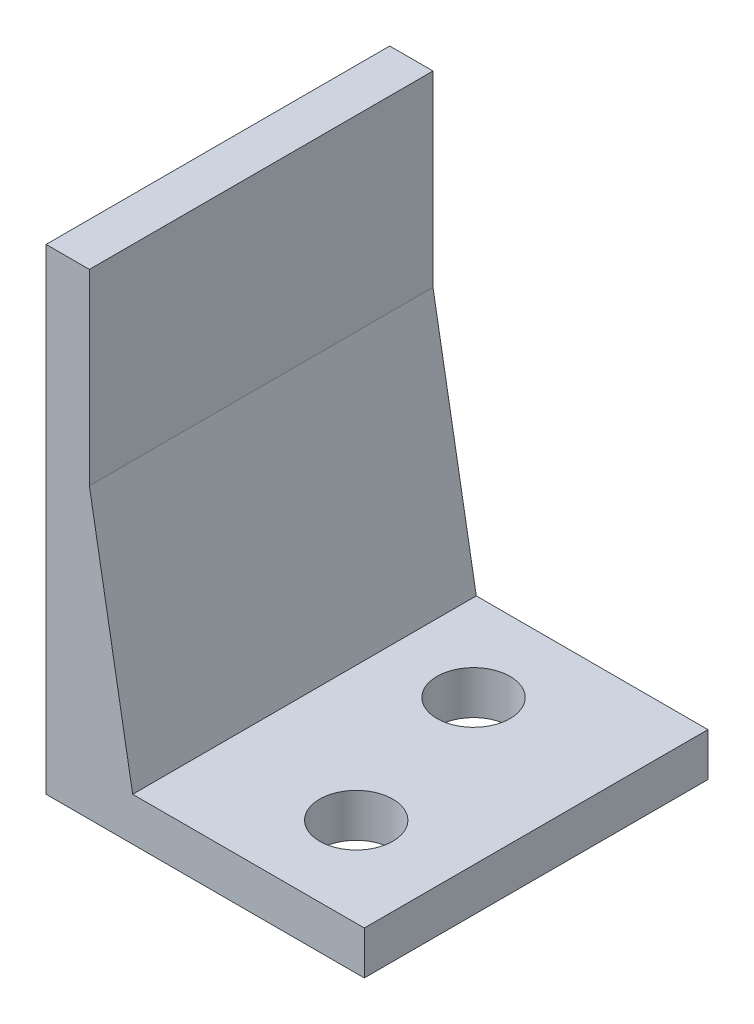
ISO-10303-21;
HEADER;
FILE_DESCRIPTION(('STEP AP214'),'2;1');
FILE_NAME('part.step','',(''),(''),'','','');
FILE_SCHEMA(('AUTOMOTIVE_DESIGN { 1 0 10303 214 1 1 1 1 }'));
ENDSEC;
DATA;
#1=APPLICATION_CONTEXT('core data for automotive mechanical design processes');
#2=APPLICATION_PROTOCOL_DEFINITION('international standard','automotive_design',2000,#1);
#3=PRODUCT_CONTEXT('',#1,'mechanical');
#4=PRODUCT('Part','Part','',(#3));
#5=PRODUCT_RELATED_PRODUCT_CATEGORY('part','',(#4));
#6=PRODUCT_DEFINITION_FORMATION('','',#4);
#7=PRODUCT_DEFINITION_CONTEXT('part definition',#1,'design');
#8=PRODUCT_DEFINITION('design','',#6,#7);
#9=PRODUCT_DEFINITION_SHAPE('','',#8);
#10=(LENGTH_UNIT() NAMED_UNIT(*) SI_UNIT(.MILLI.,.METRE.));
#11=(NAMED_UNIT(*) PLANE_ANGLE_UNIT() SI_UNIT($,.RADIAN.));
#12=(NAMED_UNIT(*) SI_UNIT($,.STERADIAN.) SOLID_ANGLE_UNIT());
#13=UNCERTAINTY_MEASURE_WITH_UNIT(LENGTH_MEASURE(1.E-05),#10,'distance_accuracy_value','');
#14=(GEOMETRIC_REPRESENTATION_CONTEXT(3) GLOBAL_UNCERTAINTY_ASSIGNED_CONTEXT((#13)) GLOBAL_UNIT_ASSIGNED_CONTEXT((#10,
#11,#12)) REPRESENTATION_CONTEXT('',''));
#15=CARTESIAN_POINT('',(0.,0.,0.));
#16=DIRECTION('',(0.,0.,1.));
#17=DIRECTION('',(1.,0.,0.));
#18=AXIS2_PLACEMENT_3D('',#15,#16,#17);
#19=CARTESIAN_POINT('',(29.4,0.,31.75));
#20=DIRECTION('',(0.,1.,0.));
#21=DIRECTION('',(-1.,0.,0.));
#22=AXIS2_PLACEMENT_3D('',#19,#20,#21);
#23=PLANE('',#22);
#24=CARTESIAN_POINT('',(20.4,0.,23.495));
#25=DIRECTION('',(0.,1.,0.));
#26=DIRECTION('',(0.,0.,1.));
#27=AXIS2_PLACEMENT_3D('',#24,#25,#26);
#28=CIRCLE('',#27,3.3782);
#29=CARTESIAN_POINT('',(20.4,0.,26.8732));
#30=VERTEX_POINT('',#29);
#31=EDGE_CURVE('E155',#30,#30,#28,.T.);
#32=ORIENTED_EDGE('',*,*,#31,.T.);
#33=EDGE_LOOP('',(#32));
#34=FACE_BOUND('',#33,.T.);
#35=CARTESIAN_POINT('',(16.,0.,8.255));
#36=DIRECTION('',(0.,1.,0.));
#37=DIRECTION('',(0.,0.,1.));
#38=AXIS2_PLACEMENT_3D('',#35,#36,#37);
#39=CIRCLE('',#38,3.3782);
#40=CARTESIAN_POINT('',(16.,0.,11.6332));
#41=VERTEX_POINT('',#40);
#42=EDGE_CURVE('E143',#41,#41,#39,.T.);
#43=ORIENTED_EDGE('',*,*,#42,.T.);
#44=EDGE_LOOP('',(#43));
#45=FACE_BOUND('',#44,.T.);
#46=DIRECTION('',(1.,0.,0.));
#47=VECTOR('',#46,1.);
#48=CARTESIAN_POINT('',(29.4,0.,0.));
#49=LINE('',#48,#47);
#50=CARTESIAN_POINT('',(0.,0.,0.));
#51=VERTEX_POINT('',#50);
#52=CARTESIAN_POINT('',(29.4,0.,0.));
#53=VERTEX_POINT('',#52);
#54=EDGE_CURVE('E117',#51,#53,#49,.T.);
#55=ORIENTED_EDGE('',*,*,#54,.T.);
#56=DIRECTION('',(0.,0.,-1.));
#57=VECTOR('',#56,1.);
#58=CARTESIAN_POINT('',(29.4,0.,31.75));
#59=LINE('',#58,#57);
#60=CARTESIAN_POINT('',(29.4,0.,31.75));
#61=VERTEX_POINT('',#60);
#62=EDGE_CURVE('E99',#61,#53,#59,.T.);
#63=ORIENTED_EDGE('',*,*,#62,.F.);
#64=DIRECTION('',(1.,0.,0.));
#65=VECTOR('',#64,1.);
#66=CARTESIAN_POINT('',(29.4,0.,31.75));
#67=LINE('',#66,#65);
#68=CARTESIAN_POINT('',(0.,0.,31.75));
#69=VERTEX_POINT('',#68);
#70=EDGE_CURVE('E105',#69,#61,#67,.T.);
#71=ORIENTED_EDGE('',*,*,#70,.F.);
#72=DIRECTION('',(0.,0.,-1.));
#73=VECTOR('',#72,1.);
#74=CARTESIAN_POINT('',(0.,0.,31.75));
#75=LINE('',#74,#73);
#76=EDGE_CURVE('E131',#69,#51,#75,.T.);
#77=ORIENTED_EDGE('',*,*,#76,.T.);
#78=EDGE_LOOP('',(#55,#63,#71,#77));
#79=FACE_BOUND('',#78,.T.);
#80=ADVANCED_FACE('F35',(#34,#45,#79),#23,.F.);
#81=CARTESIAN_POINT('',(29.4,4.,31.75));
#82=DIRECTION('',(-1.,0.,0.));
#83=DIRECTION('',(0.,0.,1.));
#84=AXIS2_PLACEMENT_3D('',#81,#82,#83);
#85=PLANE('',#84);
#86=DIRECTION('',(0.,1.,0.));
#87=VECTOR('',#86,1.);
#88=CARTESIAN_POINT('',(29.4,4.,0.));
#89=LINE('',#88,#87);
#90=CARTESIAN_POINT('',(29.4,4.,0.));
#91=VERTEX_POINT('',#90);
#92=EDGE_CURVE('E140',#53,#91,#89,.T.);
#93=ORIENTED_EDGE('',*,*,#92,.T.);
#94=DIRECTION('',(0.,0.,-1.));
#95=VECTOR('',#94,1.);
#96=CARTESIAN_POINT('',(29.4,4.,31.75));
#97=LINE('',#96,#95);
#98=CARTESIAN_POINT('',(29.4,4.,31.75));
#99=VERTEX_POINT('',#98);
#100=EDGE_CURVE('E102',#99,#91,#97,.T.);
#101=ORIENTED_EDGE('',*,*,#100,.F.);
#102=DIRECTION('',(0.,1.,0.));
#103=VECTOR('',#102,1.);
#104=CARTESIAN_POINT('',(29.4,4.,31.75));
#105=LINE('',#104,#103);
#106=EDGE_CURVE('E95',#61,#99,#105,.T.);
#107=ORIENTED_EDGE('',*,*,#106,.F.);
#108=ORIENTED_EDGE('',*,*,#62,.T.);
#109=EDGE_LOOP('',(#93,#101,#107,#108));
#110=FACE_BOUND('',#109,.T.);
#111=ADVANCED_FACE('F97',(#110),#85,.F.);
#112=CARTESIAN_POINT('',(4.,4.,31.75));
#113=DIRECTION('',(0.,-1.,0.));
#114=DIRECTION('',(1.,0.,0.));
#115=AXIS2_PLACEMENT_3D('',#112,#113,#114);
#116=PLANE('',#115);
#117=CARTESIAN_POINT('',(20.4,4.,23.495));
#118=DIRECTION('',(0.,1.,0.));
#119=DIRECTION('',(0.,0.,1.));
#120=AXIS2_PLACEMENT_3D('',#117,#118,#119);
#121=CIRCLE('',#120,3.37819999999999);
#122=CARTESIAN_POINT('',(20.4,4.,26.8732));
#123=VERTEX_POINT('',#122);
#124=EDGE_CURVE('E158',#123,#123,#121,.T.);
#125=ORIENTED_EDGE('',*,*,#124,.F.);
#126=EDGE_LOOP('',(#125));
#127=FACE_BOUND('',#126,.T.);
#128=CARTESIAN_POINT('',(16.,4.,8.255));
#129=DIRECTION('',(0.,1.,0.));
#130=DIRECTION('',(0.,0.,1.));
#131=AXIS2_PLACEMENT_3D('',#128,#129,#130);
#132=CIRCLE('',#131,3.37819999999999);
#133=CARTESIAN_POINT('',(16.,4.,11.6332));
#134=VERTEX_POINT('',#133);
#135=EDGE_CURVE('E152',#134,#134,#132,.T.);
#136=ORIENTED_EDGE('',*,*,#135,.F.);
#137=EDGE_LOOP('',(#136));
#138=FACE_BOUND('',#137,.T.);
#139=DIRECTION('',(-1.,0.,0.));
#140=VECTOR('',#139,1.);
#141=CARTESIAN_POINT('',(4.,4.,0.));
#142=LINE('',#141,#140);
#143=CARTESIAN_POINT('',(8.,4.,0.));
#144=VERTEX_POINT('',#143);
#145=EDGE_CURVE('E138',#91,#144,#142,.T.);
#146=ORIENTED_EDGE('',*,*,#145,.T.);
#147=DIRECTION('',(0.,0.,1.));
#148=VECTOR('',#147,1.);
#149=CARTESIAN_POINT('',(8.,4.,31.75));
#150=LINE('',#149,#148);
#151=CARTESIAN_POINT('',(8.,4.,31.75));
#152=VERTEX_POINT('',#151);
#153=EDGE_CURVE('E51',#144,#152,#150,.T.);
#154=ORIENTED_EDGE('',*,*,#153,.T.);
#155=DIRECTION('',(-1.,0.,0.));
#156=VECTOR('',#155,1.);
#157=CARTESIAN_POINT('',(4.,4.,31.75));
#158=LINE('',#157,#156);
#159=EDGE_CURVE('E104',#99,#152,#158,.T.);
#160=ORIENTED_EDGE('',*,*,#159,.F.);
#161=ORIENTED_EDGE('',*,*,#100,.T.);
#162=EDGE_LOOP('',(#146,#154,#160,#161));
#163=FACE_BOUND('',#162,.T.);
#164=ADVANCED_FACE('F164',(#127,#138,#163),#116,.F.);
#165=CARTESIAN_POINT('',(3.99999999999999,44.,31.75));
#166=DIRECTION('',(-1.,0.,0.));
#167=DIRECTION('',(0.,-1.,0.));
#168=AXIS2_PLACEMENT_3D('',#165,#166,#167);
#169=PLANE('',#168);
#170=DIRECTION('',(0.,1.,0.));
#171=VECTOR('',#170,1.);
#172=CARTESIAN_POINT('',(3.99999999999999,44.,31.75));
#173=LINE('',#172,#171);
#174=CARTESIAN_POINT('',(4.,26.6851272784717,31.75));
#175=VERTEX_POINT('',#174);
#176=CARTESIAN_POINT('',(3.99999999999999,44.,31.75));
#177=VERTEX_POINT('',#176);
#178=EDGE_CURVE('E147',#175,#177,#173,.T.);
#179=ORIENTED_EDGE('',*,*,#178,.F.);
#180=DIRECTION('',(0.,0.,-1.));
#181=VECTOR('',#180,1.);
#182=CARTESIAN_POINT('',(4.,26.6851272784717,0.));
#183=LINE('',#182,#181);
#184=CARTESIAN_POINT('',(4.,26.6851272784717,0.));
#185=VERTEX_POINT('',#184);
#186=EDGE_CURVE('E118',#175,#185,#183,.T.);
#187=ORIENTED_EDGE('',*,*,#186,.T.);
#188=DIRECTION('',(0.,1.,0.));
#189=VECTOR('',#188,1.);
#190=CARTESIAN_POINT('',(3.99999999999999,44.,0.));
#191=LINE('',#190,#189);
#192=CARTESIAN_POINT('',(3.99999999999999,44.,0.));
#193=VERTEX_POINT('',#192);
#194=EDGE_CURVE('E136',#185,#193,#191,.T.);
#195=ORIENTED_EDGE('',*,*,#194,.T.);
#196=DIRECTION('',(0.,0.,-1.));
#197=VECTOR('',#196,1.);
#198=CARTESIAN_POINT('',(3.99999999999999,44.,31.75));
#199=LINE('',#198,#197);
#200=EDGE_CURVE('E122',#177,#193,#199,.T.);
#201=ORIENTED_EDGE('',*,*,#200,.F.);
#202=EDGE_LOOP('',(#179,#187,#195,#201));
#203=FACE_BOUND('',#202,.T.);
#204=ADVANCED_FACE('F167',(#203),#169,.F.);
#205=CARTESIAN_POINT('',(0.,44.,31.75));
#206=DIRECTION('',(0.,-1.,0.));
#207=DIRECTION('',(0.,0.,-1.));
#208=AXIS2_PLACEMENT_3D('',#205,#206,#207);
#209=PLANE('',#208);
#210=DIRECTION('',(-1.,0.,0.));
#211=VECTOR('',#210,1.);
#212=CARTESIAN_POINT('',(0.,44.,0.));
#213=LINE('',#212,#211);
#214=CARTESIAN_POINT('',(0.,44.,0.));
#215=VERTEX_POINT('',#214);
#216=EDGE_CURVE('E134',#193,#215,#213,.T.);
#217=ORIENTED_EDGE('',*,*,#216,.T.);
#218=DIRECTION('',(0.,0.,-1.));
#219=VECTOR('',#218,1.);
#220=CARTESIAN_POINT('',(0.,44.,31.75));
#221=LINE('',#220,#219);
#222=CARTESIAN_POINT('',(0.,44.,31.75));
#223=VERTEX_POINT('',#222);
#224=EDGE_CURVE('E128',#223,#215,#221,.T.);
#225=ORIENTED_EDGE('',*,*,#224,.F.);
#226=DIRECTION('',(-1.,0.,0.));
#227=VECTOR('',#226,1.);
#228=CARTESIAN_POINT('',(0.,44.,31.75));
#229=LINE('',#228,#227);
#230=EDGE_CURVE('E145',#177,#223,#229,.T.);
#231=ORIENTED_EDGE('',*,*,#230,.F.);
#232=ORIENTED_EDGE('',*,*,#200,.T.);
#233=EDGE_LOOP('',(#217,#225,#231,#232));
#234=FACE_BOUND('',#233,.T.);
#235=ADVANCED_FACE('F180',(#234),#209,.F.);
#236=CARTESIAN_POINT('',(0.,0.,31.75));
#237=DIRECTION('',(1.,0.,0.));
#238=DIRECTION('',(0.,1.,0.));
#239=AXIS2_PLACEMENT_3D('',#236,#237,#238);
#240=PLANE('',#239);
#241=DIRECTION('',(0.,-1.,0.));
#242=VECTOR('',#241,1.);
#243=CARTESIAN_POINT('',(0.,0.,0.));
#244=LINE('',#243,#242);
#245=EDGE_CURVE('E114',#215,#51,#244,.T.);
#246=ORIENTED_EDGE('',*,*,#245,.T.);
#247=ORIENTED_EDGE('',*,*,#76,.F.);
#248=DIRECTION('',(0.,-1.,0.));
#249=VECTOR('',#248,1.);
#250=CARTESIAN_POINT('',(0.,0.,31.75));
#251=LINE('',#250,#249);
#252=EDGE_CURVE('E110',#223,#69,#251,.T.);
#253=ORIENTED_EDGE('',*,*,#252,.F.);
#254=ORIENTED_EDGE('',*,*,#224,.T.);
#255=EDGE_LOOP('',(#246,#247,#253,#254));
#256=FACE_BOUND('',#255,.T.);
#257=ADVANCED_FACE('F183',(#256),#240,.F.);
#258=CARTESIAN_POINT('',(0.,0.,31.75));
#259=DIRECTION('',(0.,0.,-1.));
#260=DIRECTION('',(-1.,0.,0.));
#261=AXIS2_PLACEMENT_3D('',#258,#259,#260);
#262=PLANE('',#261);
#263=ORIENTED_EDGE('',*,*,#70,.T.);
#264=ORIENTED_EDGE('',*,*,#106,.T.);
#265=ORIENTED_EDGE('',*,*,#159,.T.);
#266=DIRECTION('',(0.173648177666924,-0.984807753012209,0.));
#267=VECTOR('',#266,1.);
#268=CARTESIAN_POINT('',(8.44281076979497,1.4886953317308,31.75));
#269=LINE('',#268,#267);
#270=EDGE_CURVE('E11',#152,#175,#269,.F.);
#271=ORIENTED_EDGE('',*,*,#270,.T.);
#272=ORIENTED_EDGE('',*,*,#178,.T.);
#273=ORIENTED_EDGE('',*,*,#230,.T.);
#274=ORIENTED_EDGE('',*,*,#252,.T.);
#275=EDGE_LOOP('',(#263,#264,#265,#271,#272,#273,#274));
#276=FACE_BOUND('',#275,.T.);
#277=ADVANCED_FACE('F108',(#276),#262,.F.);
#278=CARTESIAN_POINT('',(0.,0.,0.));
#279=DIRECTION('',(0.,0.,-1.));
#280=DIRECTION('',(-1.,0.,0.));
#281=AXIS2_PLACEMENT_3D('',#278,#279,#280);
#282=PLANE('',#281);
#283=ORIENTED_EDGE('',*,*,#54,.F.);
#284=ORIENTED_EDGE('',*,*,#245,.F.);
#285=ORIENTED_EDGE('',*,*,#216,.F.);
#286=ORIENTED_EDGE('',*,*,#194,.F.);
#287=DIRECTION('',(-0.173648177666924,0.984807753012209,0.));
#288=VECTOR('',#287,1.);
#289=CARTESIAN_POINT('',(4.,26.6851272784717,0.));
#290=LINE('',#289,#288);
#291=EDGE_CURVE('E44',#185,#144,#290,.F.);
#292=ORIENTED_EDGE('',*,*,#291,.T.);
#293=ORIENTED_EDGE('',*,*,#145,.F.);
#294=ORIENTED_EDGE('',*,*,#92,.F.);
#295=EDGE_LOOP('',(#283,#284,#285,#286,#292,#293,#294));
#296=FACE_BOUND('',#295,.T.);
#297=ADVANCED_FACE('F184',(#296),#282,.T.);
#298=CARTESIAN_POINT('',(16.,4.,8.255));
#299=DIRECTION('',(0.,1.,0.));
#300=DIRECTION('',(0.,0.,1.));
#301=AXIS2_PLACEMENT_3D('',#298,#299,#300);
#302=CYLINDRICAL_SURFACE('',#301,3.37819999999999);
#303=ORIENTED_EDGE('',*,*,#42,.F.);
#304=EDGE_LOOP('',(#303));
#305=FACE_BOUND('',#304,.T.);
#306=ORIENTED_EDGE('',*,*,#135,.T.);
#307=EDGE_LOOP('',(#306));
#308=FACE_BOUND('',#307,.T.);
#309=ADVANCED_FACE('F186',(#305,#308),#302,.F.);
#310=CARTESIAN_POINT('',(20.4,4.,23.495));
#311=DIRECTION('',(0.,1.,0.));
#312=DIRECTION('',(0.,0.,1.));
#313=AXIS2_PLACEMENT_3D('',#310,#311,#312);
#314=CYLINDRICAL_SURFACE('',#313,3.37819999999999);
#315=ORIENTED_EDGE('',*,*,#31,.F.);
#316=EDGE_LOOP('',(#315));
#317=FACE_BOUND('',#316,.T.);
#318=ORIENTED_EDGE('',*,*,#124,.T.);
#319=EDGE_LOOP('',(#318));
#320=FACE_BOUND('',#319,.T.);
#321=ADVANCED_FACE('F162',(#317,#320),#314,.F.);
#322=CARTESIAN_POINT('',(4.,26.6851272784717,31.75));
#323=DIRECTION('',(0.984807753012209,0.173648177666924,0.));
#324=DIRECTION('',(0.,0.,1.));
#325=AXIS2_PLACEMENT_3D('',#322,#323,#324);
#326=PLANE('',#325);
#327=ORIENTED_EDGE('',*,*,#270,.F.);
#328=ORIENTED_EDGE('',*,*,#153,.F.);
#329=ORIENTED_EDGE('',*,*,#291,.F.);
#330=ORIENTED_EDGE('',*,*,#186,.F.);
#331=EDGE_LOOP('',(#327,#328,#329,#330));
#332=FACE_BOUND('',#331,.T.);
#333=ADVANCED_FACE('F38',(#332),#326,.T.);
#334=CLOSED_SHELL('',(#80,#111,#164,#204,#235,#257,#277,#297,#309,#321,#333));
#335=MANIFOLD_SOLID_BREP('B2',#334);
#336=ADVANCED_BREP_SHAPE_REPRESENTATION('',(#18,#335),#14);
#337=SHAPE_DEFINITION_REPRESENTATION(#9,#336);
ENDSEC;
END-ISO-10303-21;
